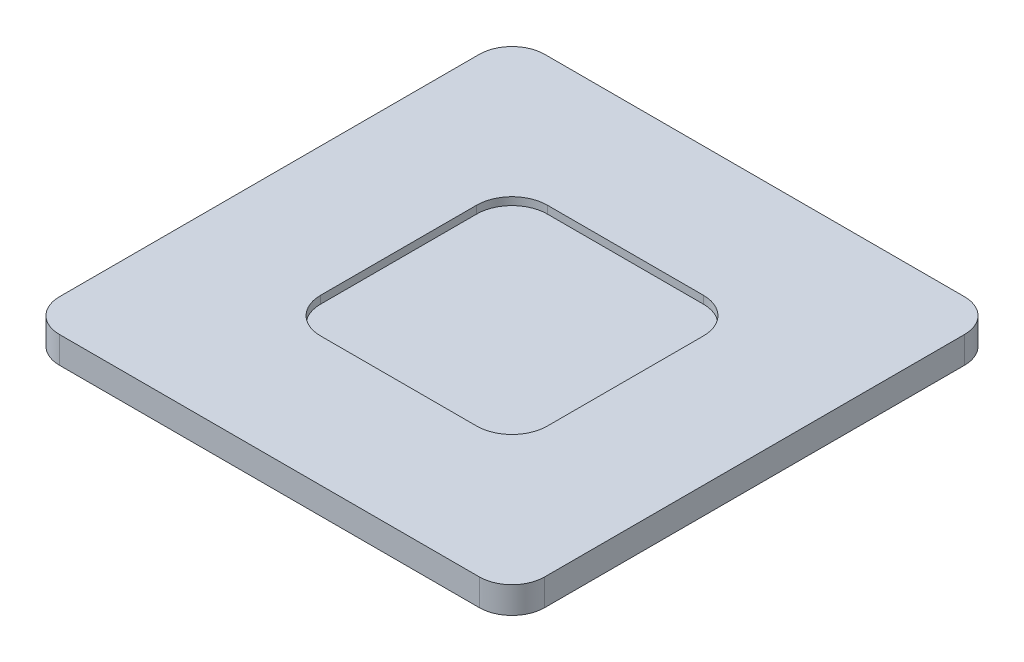
ISO-10303-21;
HEADER;
FILE_DESCRIPTION(('STEP AP214'),'2;1');
FILE_NAME('part.step','',(''),(''),'','','');
FILE_SCHEMA(('AUTOMOTIVE_DESIGN { 1 0 10303 214 1 1 1 1 }'));
ENDSEC;
DATA;
#1=APPLICATION_CONTEXT('core data for automotive mechanical design processes');
#2=APPLICATION_PROTOCOL_DEFINITION('international standard','automotive_design',2000,#1);
#3=PRODUCT_CONTEXT('',#1,'mechanical');
#4=PRODUCT('Part','Part','',(#3));
#5=PRODUCT_RELATED_PRODUCT_CATEGORY('part','',(#4));
#6=PRODUCT_DEFINITION_FORMATION('','',#4);
#7=PRODUCT_DEFINITION_CONTEXT('part definition',#1,'design');
#8=PRODUCT_DEFINITION('design','',#6,#7);
#9=PRODUCT_DEFINITION_SHAPE('','',#8);
#10=(LENGTH_UNIT() NAMED_UNIT(*) SI_UNIT(.MILLI.,.METRE.));
#11=(NAMED_UNIT(*) PLANE_ANGLE_UNIT() SI_UNIT($,.RADIAN.));
#12=(NAMED_UNIT(*) SI_UNIT($,.STERADIAN.) SOLID_ANGLE_UNIT());
#13=UNCERTAINTY_MEASURE_WITH_UNIT(LENGTH_MEASURE(1.E-05),#10,'distance_accuracy_value','');
#14=(GEOMETRIC_REPRESENTATION_CONTEXT(3) GLOBAL_UNCERTAINTY_ASSIGNED_CONTEXT((#13)) GLOBAL_UNIT_ASSIGNED_CONTEXT((#10,
#11,#12)) REPRESENTATION_CONTEXT('',''));
#15=CARTESIAN_POINT('',(0.,0.,0.));
#16=DIRECTION('',(0.,0.,1.));
#17=DIRECTION('',(1.,0.,0.));
#18=AXIS2_PLACEMENT_3D('',#15,#16,#17);
#19=CARTESIAN_POINT('',(0.253999999999999,2.5908,-47.371));
#20=DIRECTION('',(1.,0.,0.));
#21=DIRECTION('',(0.,0.,-1.));
#22=AXIS2_PLACEMENT_3D('',#19,#20,#21);
#23=PLANE('',#22);
#24=DIRECTION('',(0.,0.,1.));
#25=VECTOR('',#24,1.);
#26=CARTESIAN_POINT('',(0.253999999999999,0.,-47.371));
#27=LINE('',#26,#25);
#28=CARTESIAN_POINT('',(0.253999999999999,0.,-44.196));
#29=VERTEX_POINT('',#28);
#30=CARTESIAN_POINT('',(0.253999999999999,0.,-3.429));
#31=VERTEX_POINT('',#30);
#32=EDGE_CURVE('E230',#29,#31,#27,.T.);
#33=ORIENTED_EDGE('',*,*,#32,.T.);
#34=DIRECTION('',(0.,-1.,0.));
#35=VECTOR('',#34,1.);
#36=CARTESIAN_POINT('',(0.253999999999999,2.5908,-3.429));
#37=LINE('',#36,#35);
#38=CARTESIAN_POINT('',(0.253999999999999,2.5908,-3.429));
#39=VERTEX_POINT('',#38);
#40=EDGE_CURVE('E300',#31,#39,#37,.F.);
#41=ORIENTED_EDGE('',*,*,#40,.T.);
#42=DIRECTION('',(0.,0.,1.));
#43=VECTOR('',#42,1.);
#44=CARTESIAN_POINT('',(0.253999999999999,2.5908,-47.371));
#45=LINE('',#44,#43);
#46=CARTESIAN_POINT('',(0.253999999999999,2.5908,-44.196));
#47=VERTEX_POINT('',#46);
#48=EDGE_CURVE('E248',#47,#39,#45,.T.);
#49=ORIENTED_EDGE('',*,*,#48,.F.);
#50=DIRECTION('',(0.,-1.,0.));
#51=VECTOR('',#50,1.);
#52=CARTESIAN_POINT('',(0.253999999999999,2.5908,-44.196));
#53=LINE('',#52,#51);
#54=EDGE_CURVE('E296',#47,#29,#53,.T.);
#55=ORIENTED_EDGE('',*,*,#54,.T.);
#56=EDGE_LOOP('',(#33,#41,#49,#55));
#57=FACE_BOUND('',#56,.T.);
#58=ADVANCED_FACE('F38',(#57),#23,.F.);
#59=CARTESIAN_POINT('',(0.253999999999999,2.5908,-0.254));
#60=DIRECTION('',(0.,0.,-1.));
#61=DIRECTION('',(-1.,0.,0.));
#62=AXIS2_PLACEMENT_3D('',#59,#60,#61);
#63=PLANE('',#62);
#64=DIRECTION('',(1.,0.,0.));
#65=VECTOR('',#64,1.);
#66=CARTESIAN_POINT('',(0.253999999999999,2.5908,-0.254));
#67=LINE('',#66,#65);
#68=CARTESIAN_POINT('',(3.429,2.5908,-0.254));
#69=VERTEX_POINT('',#68);
#70=CARTESIAN_POINT('',(44.196,2.5908,-0.253999999999997));
#71=VERTEX_POINT('',#70);
#72=EDGE_CURVE('E252',#69,#71,#67,.T.);
#73=ORIENTED_EDGE('',*,*,#72,.F.);
#74=DIRECTION('',(0.,-1.,0.));
#75=VECTOR('',#74,1.);
#76=CARTESIAN_POINT('',(3.429,2.5908,-0.254));
#77=LINE('',#76,#75);
#78=CARTESIAN_POINT('',(3.429,0.,-0.254));
#79=VERTEX_POINT('',#78);
#80=EDGE_CURVE('E280',#69,#79,#77,.T.);
#81=ORIENTED_EDGE('',*,*,#80,.T.);
#82=DIRECTION('',(1.,0.,0.));
#83=VECTOR('',#82,1.);
#84=CARTESIAN_POINT('',(0.253999999999999,0.,-0.254));
#85=LINE('',#84,#83);
#86=CARTESIAN_POINT('',(44.196,0.,-0.253999999999997));
#87=VERTEX_POINT('',#86);
#88=EDGE_CURVE('E268',#79,#87,#85,.T.);
#89=ORIENTED_EDGE('',*,*,#88,.T.);
#90=DIRECTION('',(0.,-1.,0.));
#91=VECTOR('',#90,1.);
#92=CARTESIAN_POINT('',(44.196,2.5908,-0.253999999999997));
#93=LINE('',#92,#91);
#94=EDGE_CURVE('E264',#87,#71,#93,.F.);
#95=ORIENTED_EDGE('',*,*,#94,.T.);
#96=EDGE_LOOP('',(#73,#81,#89,#95));
#97=FACE_BOUND('',#96,.T.);
#98=ADVANCED_FACE('F354',(#97),#63,.F.);
#99=CARTESIAN_POINT('',(47.371,2.5908,-47.371));
#100=DIRECTION('',(-1.,0.,0.));
#101=DIRECTION('',(0.,0.,1.));
#102=AXIS2_PLACEMENT_3D('',#99,#100,#101);
#103=PLANE('',#102);
#104=DIRECTION('',(0.,0.,-1.));
#105=VECTOR('',#104,1.);
#106=CARTESIAN_POINT('',(47.371,2.5908,-47.371));
#107=LINE('',#106,#105);
#108=CARTESIAN_POINT('',(47.371,2.5908,-3.429));
#109=VERTEX_POINT('',#108);
#110=CARTESIAN_POINT('',(47.371,2.5908,-44.196));
#111=VERTEX_POINT('',#110);
#112=EDGE_CURVE('E257',#109,#111,#107,.T.);
#113=ORIENTED_EDGE('',*,*,#112,.F.);
#114=DIRECTION('',(0.,-1.,0.));
#115=VECTOR('',#114,1.);
#116=CARTESIAN_POINT('',(47.371,2.5908,-3.429));
#117=LINE('',#116,#115);
#118=CARTESIAN_POINT('',(47.371,0.,-3.429));
#119=VERTEX_POINT('',#118);
#120=EDGE_CURVE('E318',#109,#119,#117,.T.);
#121=ORIENTED_EDGE('',*,*,#120,.T.);
#122=DIRECTION('',(0.,0.,-1.));
#123=VECTOR('',#122,1.);
#124=CARTESIAN_POINT('',(47.371,0.,-47.371));
#125=LINE('',#124,#123);
#126=CARTESIAN_POINT('',(47.371,0.,-44.196));
#127=VERTEX_POINT('',#126);
#128=EDGE_CURVE('E272',#119,#127,#125,.T.);
#129=ORIENTED_EDGE('',*,*,#128,.T.);
#130=DIRECTION('',(0.,-1.,0.));
#131=VECTOR('',#130,1.);
#132=CARTESIAN_POINT('',(47.371,2.5908,-44.196));
#133=LINE('',#132,#131);
#134=EDGE_CURVE('E315',#127,#111,#133,.F.);
#135=ORIENTED_EDGE('',*,*,#134,.T.);
#136=EDGE_LOOP('',(#113,#121,#129,#135));
#137=FACE_BOUND('',#136,.T.);
#138=ADVANCED_FACE('F326',(#137),#103,.F.);
#139=CARTESIAN_POINT('',(0.253999999999999,2.5908,-47.371));
#140=DIRECTION('',(0.,0.,1.));
#141=DIRECTION('',(1.,0.,0.));
#142=AXIS2_PLACEMENT_3D('',#139,#140,#141);
#143=PLANE('',#142);
#144=DIRECTION('',(-1.,0.,0.));
#145=VECTOR('',#144,1.);
#146=CARTESIAN_POINT('',(0.253999999999999,2.5908,-47.371));
#147=LINE('',#146,#145);
#148=CARTESIAN_POINT('',(44.196,2.5908,-47.371));
#149=VERTEX_POINT('',#148);
#150=CARTESIAN_POINT('',(3.429,2.5908,-47.371));
#151=VERTEX_POINT('',#150);
#152=EDGE_CURVE('E261',#149,#151,#147,.T.);
#153=ORIENTED_EDGE('',*,*,#152,.F.);
#154=DIRECTION('',(0.,-1.,0.));
#155=VECTOR('',#154,1.);
#156=CARTESIAN_POINT('',(44.196,2.5908,-47.371));
#157=LINE('',#156,#155);
#158=CARTESIAN_POINT('',(44.196,0.,-47.371));
#159=VERTEX_POINT('',#158);
#160=EDGE_CURVE('E11',#149,#159,#157,.T.);
#161=ORIENTED_EDGE('',*,*,#160,.T.);
#162=DIRECTION('',(-1.,0.,0.));
#163=VECTOR('',#162,1.);
#164=CARTESIAN_POINT('',(0.253999999999999,0.,-47.371));
#165=LINE('',#164,#163);
#166=CARTESIAN_POINT('',(3.429,0.,-47.371));
#167=VERTEX_POINT('',#166);
#168=EDGE_CURVE('E253',#159,#167,#165,.T.);
#169=ORIENTED_EDGE('',*,*,#168,.T.);
#170=DIRECTION('',(0.,-1.,0.));
#171=VECTOR('',#170,1.);
#172=CARTESIAN_POINT('',(3.429,2.5908,-47.371));
#173=LINE('',#172,#171);
#174=EDGE_CURVE('E47',#167,#151,#173,.F.);
#175=ORIENTED_EDGE('',*,*,#174,.T.);
#176=EDGE_LOOP('',(#153,#161,#169,#175));
#177=FACE_BOUND('',#176,.T.);
#178=ADVANCED_FACE('F338',(#177),#143,.F.);
#179=CARTESIAN_POINT('',(0.,2.5908,0.));
#180=DIRECTION('',(0.,1.,0.));
#181=DIRECTION('',(0.,0.,1.));
#182=AXIS2_PLACEMENT_3D('',#179,#180,#181);
#183=PLANE('',#182);
#184=CARTESIAN_POINT('',(31.387499983,2.5908,-31.387499983));
#185=DIRECTION('',(0.,1.,0.));
#186=DIRECTION('',(0.,0.,1.));
#187=AXIS2_PLACEMENT_3D('',#184,#185,#186);
#188=CIRCLE('',#187,3.429);
#189=CARTESIAN_POINT('',(34.816499983,2.5908,-31.387499983));
#190=VERTEX_POINT('',#189);
#191=CARTESIAN_POINT('',(31.387499983,2.5908,-34.816499983));
#192=VERTEX_POINT('',#191);
#193=EDGE_CURVE('E54',#190,#192,#188,.T.);
#194=ORIENTED_EDGE('',*,*,#193,.F.);
#195=DIRECTION('',(0.,0.,-1.));
#196=VECTOR('',#195,1.);
#197=CARTESIAN_POINT('',(34.816499983,2.5908,-16.237500017));
#198=LINE('',#197,#196);
#199=CARTESIAN_POINT('',(34.816499983,2.5908,-16.237500017));
#200=VERTEX_POINT('',#199);
#201=EDGE_CURVE('E177',#200,#190,#198,.T.);
#202=ORIENTED_EDGE('',*,*,#201,.F.);
#203=CARTESIAN_POINT('',(31.387499983,2.5908,-16.237500017));
#204=DIRECTION('',(0.,1.,0.));
#205=DIRECTION('',(0.,0.,1.));
#206=AXIS2_PLACEMENT_3D('',#203,#204,#205);
#207=CIRCLE('',#206,3.429);
#208=CARTESIAN_POINT('',(31.387499983,2.5908,-12.808500017));
#209=VERTEX_POINT('',#208);
#210=EDGE_CURVE('E181',#209,#200,#207,.T.);
#211=ORIENTED_EDGE('',*,*,#210,.F.);
#212=DIRECTION('',(1.,0.,0.));
#213=VECTOR('',#212,1.);
#214=CARTESIAN_POINT('',(16.237500017,2.5908,-12.808500017));
#215=LINE('',#214,#213);
#216=CARTESIAN_POINT('',(16.237500017,2.5908,-12.808500017));
#217=VERTEX_POINT('',#216);
#218=EDGE_CURVE('E220',#217,#209,#215,.T.);
#219=ORIENTED_EDGE('',*,*,#218,.F.);
#220=CARTESIAN_POINT('',(16.237500017,2.5908,-16.237500017));
#221=DIRECTION('',(0.,1.,0.));
#222=DIRECTION('',(0.,0.,1.));
#223=AXIS2_PLACEMENT_3D('',#220,#221,#222);
#224=CIRCLE('',#223,3.429);
#225=CARTESIAN_POINT('',(12.808500017,2.5908,-16.237500017));
#226=VERTEX_POINT('',#225);
#227=EDGE_CURVE('E216',#226,#217,#224,.T.);
#228=ORIENTED_EDGE('',*,*,#227,.F.);
#229=DIRECTION('',(0.,0.,1.));
#230=VECTOR('',#229,1.);
#231=CARTESIAN_POINT('',(12.808500017,2.5908,-31.387499983));
#232=LINE('',#231,#230);
#233=CARTESIAN_POINT('',(12.808500017,2.5908,-31.387499983));
#234=VERTEX_POINT('',#233);
#235=EDGE_CURVE('E212',#234,#226,#232,.T.);
#236=ORIENTED_EDGE('',*,*,#235,.F.);
#237=CARTESIAN_POINT('',(16.237500017,2.5908,-31.387499983));
#238=DIRECTION('',(0.,1.,0.));
#239=DIRECTION('',(0.,0.,1.));
#240=AXIS2_PLACEMENT_3D('',#237,#238,#239);
#241=CIRCLE('',#240,3.429);
#242=CARTESIAN_POINT('',(16.237500017,2.5908,-34.816499983));
#243=VERTEX_POINT('',#242);
#244=EDGE_CURVE('E208',#243,#234,#241,.T.);
#245=ORIENTED_EDGE('',*,*,#244,.F.);
#246=DIRECTION('',(-1.,0.,0.));
#247=VECTOR('',#246,1.);
#248=CARTESIAN_POINT('',(31.387499983,2.5908,-34.816499983));
#249=LINE('',#248,#247);
#250=EDGE_CURVE('E205',#192,#243,#249,.T.);
#251=ORIENTED_EDGE('',*,*,#250,.F.);
#252=EDGE_LOOP('',(#194,#202,#211,#219,#228,#236,#245,#251));
#253=FACE_BOUND('',#252,.T.);
#254=ORIENTED_EDGE('',*,*,#48,.T.);
#255=CARTESIAN_POINT('',(3.429,2.5908,-3.429));
#256=DIRECTION('',(0.,1.,0.));
#257=DIRECTION('',(0.,0.,1.));
#258=AXIS2_PLACEMENT_3D('',#255,#256,#257);
#259=CIRCLE('',#258,3.175);
#260=EDGE_CURVE('E312',#39,#69,#259,.T.);
#261=ORIENTED_EDGE('',*,*,#260,.T.);
#262=ORIENTED_EDGE('',*,*,#72,.T.);
#263=CARTESIAN_POINT('',(44.196,2.5908,-3.429));
#264=DIRECTION('',(0.,1.,0.));
#265=DIRECTION('',(0.,0.,1.));
#266=AXIS2_PLACEMENT_3D('',#263,#264,#265);
#267=CIRCLE('',#266,3.175);
#268=EDGE_CURVE('E309',#71,#109,#267,.T.);
#269=ORIENTED_EDGE('',*,*,#268,.T.);
#270=ORIENTED_EDGE('',*,*,#112,.T.);
#271=CARTESIAN_POINT('',(44.196,2.5908,-44.196));
#272=DIRECTION('',(0.,1.,0.));
#273=DIRECTION('',(0.,0.,1.));
#274=AXIS2_PLACEMENT_3D('',#271,#272,#273);
#275=CIRCLE('',#274,3.175);
#276=EDGE_CURVE('E306',#111,#149,#275,.T.);
#277=ORIENTED_EDGE('',*,*,#276,.T.);
#278=ORIENTED_EDGE('',*,*,#152,.T.);
#279=CARTESIAN_POINT('',(3.429,2.5908,-44.196));
#280=DIRECTION('',(0.,1.,0.));
#281=DIRECTION('',(0.,0.,1.));
#282=AXIS2_PLACEMENT_3D('',#279,#280,#281);
#283=CIRCLE('',#282,3.175);
#284=EDGE_CURVE('E303',#151,#47,#283,.T.);
#285=ORIENTED_EDGE('',*,*,#284,.T.);
#286=EDGE_LOOP('',(#254,#261,#262,#269,#270,#277,#278,#285));
#287=FACE_BOUND('',#286,.T.);
#288=ADVANCED_FACE('F341',(#253,#287),#183,.T.);
#289=CARTESIAN_POINT('',(0.,0.,0.));
#290=DIRECTION('',(0.,1.,0.));
#291=DIRECTION('',(0.,0.,1.));
#292=AXIS2_PLACEMENT_3D('',#289,#290,#291);
#293=PLANE('',#292);
#294=ORIENTED_EDGE('',*,*,#88,.F.);
#295=CARTESIAN_POINT('',(3.429,0.,-3.429));
#296=DIRECTION('',(0.,1.,0.));
#297=DIRECTION('',(0.,0.,1.));
#298=AXIS2_PLACEMENT_3D('',#295,#296,#297);
#299=CIRCLE('',#298,3.175);
#300=EDGE_CURVE('E293',#79,#31,#299,.F.);
#301=ORIENTED_EDGE('',*,*,#300,.T.);
#302=ORIENTED_EDGE('',*,*,#32,.F.);
#303=CARTESIAN_POINT('',(3.429,0.,-44.196));
#304=DIRECTION('',(0.,1.,0.));
#305=DIRECTION('',(0.,0.,1.));
#306=AXIS2_PLACEMENT_3D('',#303,#304,#305);
#307=CIRCLE('',#306,3.175);
#308=EDGE_CURVE('E284',#29,#167,#307,.F.);
#309=ORIENTED_EDGE('',*,*,#308,.T.);
#310=ORIENTED_EDGE('',*,*,#168,.F.);
#311=CARTESIAN_POINT('',(44.196,0.,-44.196));
#312=DIRECTION('',(0.,1.,0.));
#313=DIRECTION('',(0.,0.,1.));
#314=AXIS2_PLACEMENT_3D('',#311,#312,#313);
#315=CIRCLE('',#314,3.175);
#316=EDGE_CURVE('E287',#159,#127,#315,.F.);
#317=ORIENTED_EDGE('',*,*,#316,.T.);
#318=ORIENTED_EDGE('',*,*,#128,.F.);
#319=CARTESIAN_POINT('',(44.196,0.,-3.429));
#320=DIRECTION('',(0.,1.,0.));
#321=DIRECTION('',(0.,0.,1.));
#322=AXIS2_PLACEMENT_3D('',#319,#320,#321);
#323=CIRCLE('',#322,3.175);
#324=EDGE_CURVE('E290',#119,#87,#323,.F.);
#325=ORIENTED_EDGE('',*,*,#324,.T.);
#326=EDGE_LOOP('',(#294,#301,#302,#309,#310,#317,#318,#325));
#327=FACE_BOUND('',#326,.T.);
#328=ADVANCED_FACE('F332',(#327),#293,.F.);
#329=CARTESIAN_POINT('',(3.429,2.5908,-3.429));
#330=DIRECTION('',(0.,-1.,0.));
#331=DIRECTION('',(0.,0.,-1.));
#332=AXIS2_PLACEMENT_3D('',#329,#330,#331);
#333=CYLINDRICAL_SURFACE('',#332,3.175);
#334=ORIENTED_EDGE('',*,*,#260,.F.);
#335=ORIENTED_EDGE('',*,*,#40,.F.);
#336=ORIENTED_EDGE('',*,*,#300,.F.);
#337=ORIENTED_EDGE('',*,*,#80,.F.);
#338=EDGE_LOOP('',(#334,#335,#336,#337));
#339=FACE_BOUND('',#338,.T.);
#340=ADVANCED_FACE('F351',(#339),#333,.T.);
#341=CARTESIAN_POINT('',(44.196,2.5908,-3.429));
#342=DIRECTION('',(0.,-1.,0.));
#343=DIRECTION('',(0.,0.,-1.));
#344=AXIS2_PLACEMENT_3D('',#341,#342,#343);
#345=CYLINDRICAL_SURFACE('',#344,3.175);
#346=ORIENTED_EDGE('',*,*,#268,.F.);
#347=ORIENTED_EDGE('',*,*,#94,.F.);
#348=ORIENTED_EDGE('',*,*,#324,.F.);
#349=ORIENTED_EDGE('',*,*,#120,.F.);
#350=EDGE_LOOP('',(#346,#347,#348,#349));
#351=FACE_BOUND('',#350,.T.);
#352=ADVANCED_FACE('F356',(#351),#345,.T.);
#353=CARTESIAN_POINT('',(44.196,2.5908,-44.196));
#354=DIRECTION('',(0.,-1.,0.));
#355=DIRECTION('',(0.,0.,-1.));
#356=AXIS2_PLACEMENT_3D('',#353,#354,#355);
#357=CYLINDRICAL_SURFACE('',#356,3.175);
#358=ORIENTED_EDGE('',*,*,#276,.F.);
#359=ORIENTED_EDGE('',*,*,#134,.F.);
#360=ORIENTED_EDGE('',*,*,#316,.F.);
#361=ORIENTED_EDGE('',*,*,#160,.F.);
#362=EDGE_LOOP('',(#358,#359,#360,#361));
#363=FACE_BOUND('',#362,.T.);
#364=ADVANCED_FACE('F337',(#363),#357,.T.);
#365=CARTESIAN_POINT('',(3.429,2.5908,-44.196));
#366=DIRECTION('',(0.,-1.,0.));
#367=DIRECTION('',(0.,0.,-1.));
#368=AXIS2_PLACEMENT_3D('',#365,#366,#367);
#369=CYLINDRICAL_SURFACE('',#368,3.175);
#370=ORIENTED_EDGE('',*,*,#284,.F.);
#371=ORIENTED_EDGE('',*,*,#174,.F.);
#372=ORIENTED_EDGE('',*,*,#308,.F.);
#373=ORIENTED_EDGE('',*,*,#54,.F.);
#374=EDGE_LOOP('',(#370,#371,#372,#373));
#375=FACE_BOUND('',#374,.T.);
#376=ADVANCED_FACE('F40',(#375),#369,.T.);
#377=CARTESIAN_POINT('',(31.387499983,1.8408,-31.387499983));
#378=DIRECTION('',(0.,1.,0.));
#379=DIRECTION('',(0.,0.,1.));
#380=AXIS2_PLACEMENT_3D('',#377,#378,#379);
#381=CYLINDRICAL_SURFACE('',#380,3.429);
#382=ORIENTED_EDGE('',*,*,#193,.T.);
#383=DIRECTION('',(0.,1.,0.));
#384=VECTOR('',#383,1.);
#385=CARTESIAN_POINT('',(31.387499983,1.8408,-34.816499983));
#386=LINE('',#385,#384);
#387=CARTESIAN_POINT('',(31.387499983,1.8408,-34.816499983));
#388=VERTEX_POINT('',#387);
#389=EDGE_CURVE('E151',#388,#192,#386,.T.);
#390=ORIENTED_EDGE('',*,*,#389,.F.);
#391=CARTESIAN_POINT('',(31.387499983,1.8408,-31.387499983));
#392=DIRECTION('',(0.,1.,0.));
#393=DIRECTION('',(0.,0.,1.));
#394=AXIS2_PLACEMENT_3D('',#391,#392,#393);
#395=CIRCLE('',#394,3.429);
#396=CARTESIAN_POINT('',(34.816499983,1.8408,-31.387499983));
#397=VERTEX_POINT('',#396);
#398=EDGE_CURVE('E155',#397,#388,#395,.T.);
#399=ORIENTED_EDGE('',*,*,#398,.F.);
#400=DIRECTION('',(0.,1.,0.));
#401=VECTOR('',#400,1.);
#402=CARTESIAN_POINT('',(34.816499983,1.8408,-31.387499983));
#403=LINE('',#402,#401);
#404=EDGE_CURVE('E227',#397,#190,#403,.T.);
#405=ORIENTED_EDGE('',*,*,#404,.T.);
#406=EDGE_LOOP('',(#382,#390,#399,#405));
#407=FACE_BOUND('',#406,.T.);
#408=ADVANCED_FACE('F153',(#407),#381,.F.);
#409=CARTESIAN_POINT('',(34.816499983,1.8408,-16.237500017));
#410=DIRECTION('',(1.,0.,0.));
#411=DIRECTION('',(0.,0.,-1.));
#412=AXIS2_PLACEMENT_3D('',#409,#410,#411);
#413=PLANE('',#412);
#414=ORIENTED_EDGE('',*,*,#201,.T.);
#415=ORIENTED_EDGE('',*,*,#404,.F.);
#416=DIRECTION('',(0.,0.,-1.));
#417=VECTOR('',#416,1.);
#418=CARTESIAN_POINT('',(34.816499983,1.8408,-16.237500017));
#419=LINE('',#418,#417);
#420=CARTESIAN_POINT('',(34.816499983,1.8408,-16.237500017));
#421=VERTEX_POINT('',#420);
#422=EDGE_CURVE('E162',#421,#397,#419,.T.);
#423=ORIENTED_EDGE('',*,*,#422,.F.);
#424=DIRECTION('',(0.,1.,0.));
#425=VECTOR('',#424,1.);
#426=CARTESIAN_POINT('',(34.816499983,1.8408,-16.237500017));
#427=LINE('',#426,#425);
#428=EDGE_CURVE('E231',#421,#200,#427,.T.);
#429=ORIENTED_EDGE('',*,*,#428,.T.);
#430=EDGE_LOOP('',(#414,#415,#423,#429));
#431=FACE_BOUND('',#430,.T.);
#432=ADVANCED_FACE('F382',(#431),#413,.F.);
#433=CARTESIAN_POINT('',(31.387499983,1.8408,-16.237500017));
#434=DIRECTION('',(0.,1.,0.));
#435=DIRECTION('',(0.,0.,1.));
#436=AXIS2_PLACEMENT_3D('',#433,#434,#435);
#437=CYLINDRICAL_SURFACE('',#436,3.429);
#438=ORIENTED_EDGE('',*,*,#210,.T.);
#439=ORIENTED_EDGE('',*,*,#428,.F.);
#440=CARTESIAN_POINT('',(31.387499983,1.8408,-16.237500017));
#441=DIRECTION('',(0.,1.,0.));
#442=DIRECTION('',(0.,0.,1.));
#443=AXIS2_PLACEMENT_3D('',#440,#441,#442);
#444=CIRCLE('',#443,3.429);
#445=CARTESIAN_POINT('',(31.387499983,1.8408,-12.808500017));
#446=VERTEX_POINT('',#445);
#447=EDGE_CURVE('E198',#446,#421,#444,.T.);
#448=ORIENTED_EDGE('',*,*,#447,.F.);
#449=DIRECTION('',(0.,1.,0.));
#450=VECTOR('',#449,1.);
#451=CARTESIAN_POINT('',(31.387499983,1.8408,-12.808500017));
#452=LINE('',#451,#450);
#453=EDGE_CURVE('E234',#446,#209,#452,.T.);
#454=ORIENTED_EDGE('',*,*,#453,.T.);
#455=EDGE_LOOP('',(#438,#439,#448,#454));
#456=FACE_BOUND('',#455,.T.);
#457=ADVANCED_FACE('F400',(#456),#437,.F.);
#458=CARTESIAN_POINT('',(16.237500017,1.8408,-12.808500017));
#459=DIRECTION('',(0.,0.,1.));
#460=DIRECTION('',(1.,0.,0.));
#461=AXIS2_PLACEMENT_3D('',#458,#459,#460);
#462=PLANE('',#461);
#463=ORIENTED_EDGE('',*,*,#218,.T.);
#464=ORIENTED_EDGE('',*,*,#453,.F.);
#465=DIRECTION('',(1.,0.,0.));
#466=VECTOR('',#465,1.);
#467=CARTESIAN_POINT('',(16.237500017,1.8408,-12.808500017));
#468=LINE('',#467,#466);
#469=CARTESIAN_POINT('',(16.237500017,1.8408,-12.808500017));
#470=VERTEX_POINT('',#469);
#471=EDGE_CURVE('E194',#470,#446,#468,.T.);
#472=ORIENTED_EDGE('',*,*,#471,.F.);
#473=DIRECTION('',(0.,1.,0.));
#474=VECTOR('',#473,1.);
#475=CARTESIAN_POINT('',(16.237500017,1.8408,-12.808500017));
#476=LINE('',#475,#474);
#477=EDGE_CURVE('E237',#470,#217,#476,.T.);
#478=ORIENTED_EDGE('',*,*,#477,.T.);
#479=EDGE_LOOP('',(#463,#464,#472,#478));
#480=FACE_BOUND('',#479,.T.);
#481=ADVANCED_FACE('F396',(#480),#462,.F.);
#482=CARTESIAN_POINT('',(16.237500017,1.8408,-16.237500017));
#483=DIRECTION('',(0.,1.,0.));
#484=DIRECTION('',(0.,0.,1.));
#485=AXIS2_PLACEMENT_3D('',#482,#483,#484);
#486=CYLINDRICAL_SURFACE('',#485,3.429);
#487=ORIENTED_EDGE('',*,*,#227,.T.);
#488=ORIENTED_EDGE('',*,*,#477,.F.);
#489=CARTESIAN_POINT('',(16.237500017,1.8408,-16.237500017));
#490=DIRECTION('',(0.,1.,0.));
#491=DIRECTION('',(0.,0.,1.));
#492=AXIS2_PLACEMENT_3D('',#489,#490,#491);
#493=CIRCLE('',#492,3.429);
#494=CARTESIAN_POINT('',(12.808500017,1.8408,-16.237500017));
#495=VERTEX_POINT('',#494);
#496=EDGE_CURVE('E190',#495,#470,#493,.T.);
#497=ORIENTED_EDGE('',*,*,#496,.F.);
#498=DIRECTION('',(0.,1.,0.));
#499=VECTOR('',#498,1.);
#500=CARTESIAN_POINT('',(12.808500017,1.8408,-16.237500017));
#501=LINE('',#500,#499);
#502=EDGE_CURVE('E240',#495,#226,#501,.T.);
#503=ORIENTED_EDGE('',*,*,#502,.T.);
#504=EDGE_LOOP('',(#487,#488,#497,#503));
#505=FACE_BOUND('',#504,.T.);
#506=ADVANCED_FACE('F392',(#505),#486,.F.);
#507=CARTESIAN_POINT('',(12.808500017,1.8408,-31.387499983));
#508=DIRECTION('',(-1.,0.,0.));
#509=DIRECTION('',(0.,0.,1.));
#510=AXIS2_PLACEMENT_3D('',#507,#508,#509);
#511=PLANE('',#510);
#512=ORIENTED_EDGE('',*,*,#235,.T.);
#513=ORIENTED_EDGE('',*,*,#502,.F.);
#514=DIRECTION('',(0.,0.,1.));
#515=VECTOR('',#514,1.);
#516=CARTESIAN_POINT('',(12.808500017,1.8408,-31.387499983));
#517=LINE('',#516,#515);
#518=CARTESIAN_POINT('',(12.808500017,1.8408,-31.387499983));
#519=VERTEX_POINT('',#518);
#520=EDGE_CURVE('E186',#519,#495,#517,.T.);
#521=ORIENTED_EDGE('',*,*,#520,.F.);
#522=DIRECTION('',(0.,1.,0.));
#523=VECTOR('',#522,1.);
#524=CARTESIAN_POINT('',(12.808500017,1.8408,-31.387499983));
#525=LINE('',#524,#523);
#526=EDGE_CURVE('E243',#519,#234,#525,.T.);
#527=ORIENTED_EDGE('',*,*,#526,.T.);
#528=EDGE_LOOP('',(#512,#513,#521,#527));
#529=FACE_BOUND('',#528,.T.);
#530=ADVANCED_FACE('F388',(#529),#511,.F.);
#531=CARTESIAN_POINT('',(16.237500017,1.8408,-31.387499983));
#532=DIRECTION('',(0.,1.,0.));
#533=DIRECTION('',(0.,0.,1.));
#534=AXIS2_PLACEMENT_3D('',#531,#532,#533);
#535=CYLINDRICAL_SURFACE('',#534,3.429);
#536=ORIENTED_EDGE('',*,*,#244,.T.);
#537=ORIENTED_EDGE('',*,*,#526,.F.);
#538=CARTESIAN_POINT('',(16.237500017,1.8408,-31.387499983));
#539=DIRECTION('',(0.,1.,0.));
#540=DIRECTION('',(0.,0.,1.));
#541=AXIS2_PLACEMENT_3D('',#538,#539,#540);
#542=CIRCLE('',#541,3.429);
#543=CARTESIAN_POINT('',(16.237500017,1.8408,-34.816499983));
#544=VERTEX_POINT('',#543);
#545=EDGE_CURVE('E171',#544,#519,#542,.T.);
#546=ORIENTED_EDGE('',*,*,#545,.F.);
#547=DIRECTION('',(0.,1.,0.));
#548=VECTOR('',#547,1.);
#549=CARTESIAN_POINT('',(16.237500017,1.8408,-34.816499983));
#550=LINE('',#549,#548);
#551=EDGE_CURVE('E161',#544,#243,#550,.T.);
#552=ORIENTED_EDGE('',*,*,#551,.T.);
#553=EDGE_LOOP('',(#536,#537,#546,#552));
#554=FACE_BOUND('',#553,.T.);
#555=ADVANCED_FACE('F385',(#554),#535,.F.);
#556=CARTESIAN_POINT('',(31.387499983,1.8408,-34.816499983));
#557=DIRECTION('',(0.,0.,-1.));
#558=DIRECTION('',(-1.,0.,0.));
#559=AXIS2_PLACEMENT_3D('',#556,#557,#558);
#560=PLANE('',#559);
#561=ORIENTED_EDGE('',*,*,#250,.T.);
#562=ORIENTED_EDGE('',*,*,#551,.F.);
#563=DIRECTION('',(-1.,0.,0.));
#564=VECTOR('',#563,1.);
#565=CARTESIAN_POINT('',(31.387499983,1.8408,-34.816499983));
#566=LINE('',#565,#564);
#567=EDGE_CURVE('E165',#388,#544,#566,.T.);
#568=ORIENTED_EDGE('',*,*,#567,.F.);
#569=ORIENTED_EDGE('',*,*,#389,.T.);
#570=EDGE_LOOP('',(#561,#562,#568,#569));
#571=FACE_BOUND('',#570,.T.);
#572=ADVANCED_FACE('F166',(#571),#560,.F.);
#573=CARTESIAN_POINT('',(31.387499983,1.8408,-31.387499983));
#574=DIRECTION('',(0.,1.,0.));
#575=DIRECTION('',(0.,0.,1.));
#576=AXIS2_PLACEMENT_3D('',#573,#574,#575);
#577=PLANE('',#576);
#578=ORIENTED_EDGE('',*,*,#398,.T.);
#579=ORIENTED_EDGE('',*,*,#567,.T.);
#580=ORIENTED_EDGE('',*,*,#545,.T.);
#581=ORIENTED_EDGE('',*,*,#520,.T.);
#582=ORIENTED_EDGE('',*,*,#496,.T.);
#583=ORIENTED_EDGE('',*,*,#471,.T.);
#584=ORIENTED_EDGE('',*,*,#447,.T.);
#585=ORIENTED_EDGE('',*,*,#422,.T.);
#586=EDGE_LOOP('',(#578,#579,#580,#581,#582,#583,#584,#585));
#587=FACE_BOUND('',#586,.T.);
#588=ADVANCED_FACE('F173',(#587),#577,.T.);
#589=CLOSED_SHELL('',(#58,#98,#138,#178,#288,#328,#340,#352,#364,#376,#408,#432,#457,#481,#506,
#530,#555,#572,#588));
#590=MANIFOLD_SOLID_BREP('B2',#589);
#591=ADVANCED_BREP_SHAPE_REPRESENTATION('',(#18,#590),#14);
#592=SHAPE_DEFINITION_REPRESENTATION(#9,#591);
ENDSEC;
END-ISO-10303-21;
